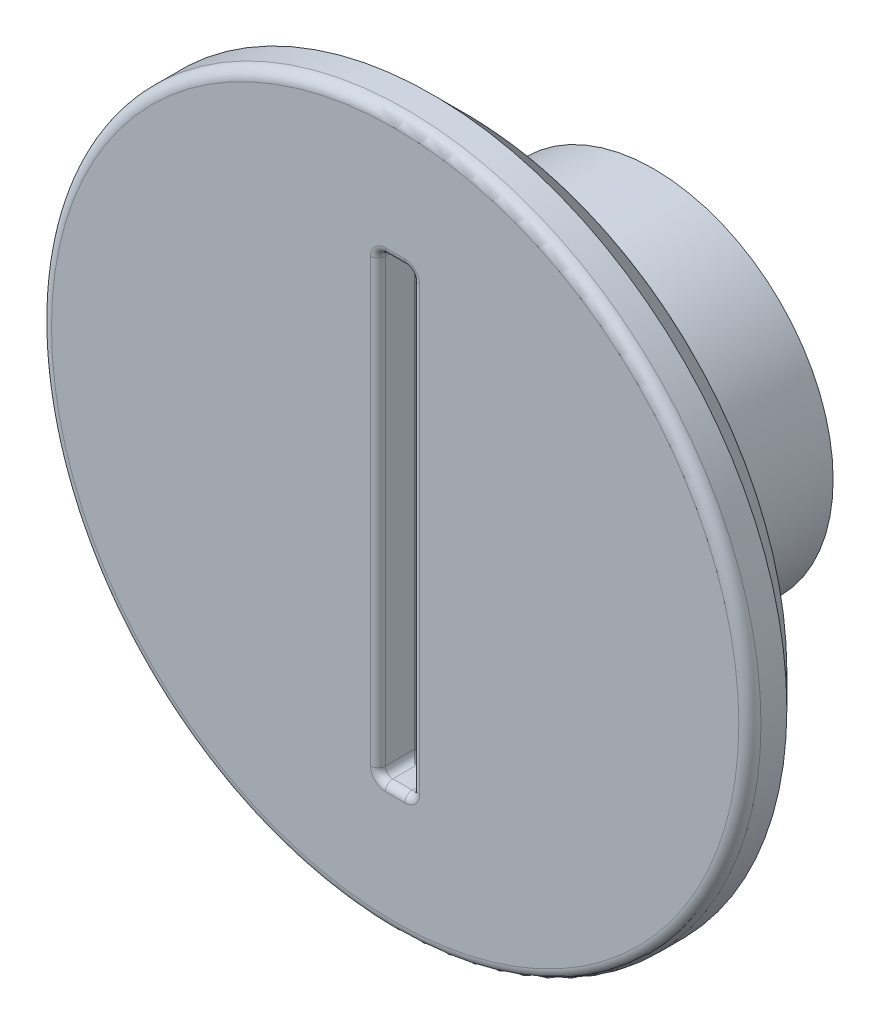
ISO-10303-21;
HEADER;
FILE_DESCRIPTION(('STEP AP214'),'2;1');
FILE_NAME('part.step','',(''),(''),'','','');
FILE_SCHEMA(('AUTOMOTIVE_DESIGN { 1 0 10303 214 1 1 1 1 }'));
ENDSEC;
DATA;
#1=APPLICATION_CONTEXT('core data for automotive mechanical design processes');
#2=APPLICATION_PROTOCOL_DEFINITION('international standard','automotive_design',2000,#1);
#3=PRODUCT_CONTEXT('',#1,'mechanical');
#4=PRODUCT('Part','Part','',(#3));
#5=PRODUCT_RELATED_PRODUCT_CATEGORY('part','',(#4));
#6=PRODUCT_DEFINITION_FORMATION('','',#4);
#7=PRODUCT_DEFINITION_CONTEXT('part definition',#1,'design');
#8=PRODUCT_DEFINITION('design','',#6,#7);
#9=PRODUCT_DEFINITION_SHAPE('','',#8);
#10=(LENGTH_UNIT() NAMED_UNIT(*) SI_UNIT(.MILLI.,.METRE.));
#11=(NAMED_UNIT(*) PLANE_ANGLE_UNIT() SI_UNIT($,.RADIAN.));
#12=(NAMED_UNIT(*) SI_UNIT($,.STERADIAN.) SOLID_ANGLE_UNIT());
#13=UNCERTAINTY_MEASURE_WITH_UNIT(LENGTH_MEASURE(1.E-05),#10,'distance_accuracy_value','');
#14=(GEOMETRIC_REPRESENTATION_CONTEXT(3) GLOBAL_UNCERTAINTY_ASSIGNED_CONTEXT((#13)) GLOBAL_UNIT_ASSIGNED_CONTEXT((#10,
#11,#12)) REPRESENTATION_CONTEXT('',''));
#15=CARTESIAN_POINT('',(0.,0.,0.));
#16=DIRECTION('',(0.,0.,1.));
#17=DIRECTION('',(1.,0.,0.));
#18=AXIS2_PLACEMENT_3D('',#15,#16,#17);
#19=CARTESIAN_POINT('',(0.,0.,2.));
#20=DIRECTION('',(0.,0.,1.));
#21=DIRECTION('',(1.,0.,0.));
#22=AXIS2_PLACEMENT_3D('',#19,#20,#21);
#23=PLANE('',#22);
#24=CARTESIAN_POINT('',(0.,0.,2.));
#25=DIRECTION('',(0.,0.,1.));
#26=DIRECTION('',(1.,0.,0.));
#27=AXIS2_PLACEMENT_3D('',#24,#25,#26);
#28=CIRCLE('',#27,9.3);
#29=CARTESIAN_POINT('',(9.3,0.,2.));
#30=VERTEX_POINT('',#29);
#31=EDGE_CURVE('E273',#30,#30,#28,.T.);
#32=ORIENTED_EDGE('',*,*,#31,.T.);
#33=EDGE_LOOP('',(#32));
#34=FACE_BOUND('',#33,.T.);
#35=CARTESIAN_POINT('',(-0.263137826376281,5.9730562337551,2.));
#36=DIRECTION('',(0.,0.,1.));
#37=DIRECTION('',(1.,0.,0.));
#38=AXIS2_PLACEMENT_3D('',#35,#36,#37);
#39=CIRCLE('',#38,0.4);
#40=CARTESIAN_POINT('',(-0.263137826376281,6.3730562337551,2.));
#41=VERTEX_POINT('',#40);
#42=CARTESIAN_POINT('',(-0.66313782637628,5.9730562337551,2.));
#43=VERTEX_POINT('',#42);
#44=EDGE_CURVE('E185',#41,#43,#39,.T.);
#45=ORIENTED_EDGE('',*,*,#44,.F.);
#46=DIRECTION('',(-1.,0.,0.));
#47=VECTOR('',#46,1.);
#48=CARTESIAN_POINT('',(0.463137826376281,6.3730562337551,2.));
#49=LINE('',#48,#47);
#50=CARTESIAN_POINT('',(0.263137826376281,6.3730562337551,2.));
#51=VERTEX_POINT('',#50);
#52=EDGE_CURVE('E177',#41,#51,#49,.F.);
#53=ORIENTED_EDGE('',*,*,#52,.T.);
#54=CARTESIAN_POINT('',(0.263137826376281,5.9730562337551,2.));
#55=DIRECTION('',(0.,0.,1.));
#56=DIRECTION('',(1.,0.,0.));
#57=AXIS2_PLACEMENT_3D('',#54,#55,#56);
#58=CIRCLE('',#57,0.4);
#59=CARTESIAN_POINT('',(0.66313782637628,5.9730562337551,2.));
#60=VERTEX_POINT('',#59);
#61=EDGE_CURVE('E176',#60,#51,#58,.T.);
#62=ORIENTED_EDGE('',*,*,#61,.F.);
#63=DIRECTION('',(0.,1.,0.));
#64=VECTOR('',#63,1.);
#65=CARTESIAN_POINT('',(0.66313782637628,-6.1730562337551,2.));
#66=LINE('',#65,#64);
#67=CARTESIAN_POINT('',(0.66313782637628,-5.9730562337551,2.));
#68=VERTEX_POINT('',#67);
#69=EDGE_CURVE('E175',#60,#68,#66,.F.);
#70=ORIENTED_EDGE('',*,*,#69,.T.);
#71=CARTESIAN_POINT('',(0.263137826376281,-5.9730562337551,2.));
#72=DIRECTION('',(0.,0.,1.));
#73=DIRECTION('',(1.,0.,0.));
#74=AXIS2_PLACEMENT_3D('',#71,#72,#73);
#75=CIRCLE('',#74,0.4);
#76=CARTESIAN_POINT('',(0.263137826376281,-6.3730562337551,2.));
#77=VERTEX_POINT('',#76);
#78=EDGE_CURVE('E169',#77,#68,#75,.T.);
#79=ORIENTED_EDGE('',*,*,#78,.F.);
#80=DIRECTION('',(1.,0.,0.));
#81=VECTOR('',#80,1.);
#82=CARTESIAN_POINT('',(-0.463137826376281,-6.3730562337551,2.));
#83=LINE('',#82,#81);
#84=CARTESIAN_POINT('',(-0.263137826376281,-6.3730562337551,2.));
#85=VERTEX_POINT('',#84);
#86=EDGE_CURVE('E161',#77,#85,#83,.F.);
#87=ORIENTED_EDGE('',*,*,#86,.T.);
#88=CARTESIAN_POINT('',(-0.263137826376281,-5.9730562337551,2.));
#89=DIRECTION('',(0.,0.,1.));
#90=DIRECTION('',(1.,0.,0.));
#91=AXIS2_PLACEMENT_3D('',#88,#89,#90);
#92=CIRCLE('',#91,0.4);
#93=CARTESIAN_POINT('',(-0.66313782637628,-5.9730562337551,2.));
#94=VERTEX_POINT('',#93);
#95=EDGE_CURVE('E158',#94,#85,#92,.T.);
#96=ORIENTED_EDGE('',*,*,#95,.F.);
#97=DIRECTION('',(0.,-1.,0.));
#98=VECTOR('',#97,1.);
#99=CARTESIAN_POINT('',(-0.66313782637628,6.1730562337551,2.));
#100=LINE('',#99,#98);
#101=EDGE_CURVE('E172',#94,#43,#100,.F.);
#102=ORIENTED_EDGE('',*,*,#101,.T.);
#103=EDGE_LOOP('',(#45,#53,#62,#70,#79,#87,#96,#102));
#104=FACE_BOUND('',#103,.T.);
#105=ADVANCED_FACE('F43',(#34,#104),#23,.T.);
#106=CARTESIAN_POINT('',(0.,0.,2.));
#107=DIRECTION('',(0.,0.,-1.));
#108=DIRECTION('',(-1.,0.,0.));
#109=AXIS2_PLACEMENT_3D('',#106,#107,#108);
#110=CYLINDRICAL_SURFACE('',#109,9.6);
#111=CARTESIAN_POINT('',(0.,0.,1.7));
#112=DIRECTION('',(0.,0.,1.));
#113=DIRECTION('',(1.,0.,0.));
#114=AXIS2_PLACEMENT_3D('',#111,#112,#113);
#115=CIRCLE('',#114,9.6);
#116=CARTESIAN_POINT('',(9.6,0.,1.7));
#117=VERTEX_POINT('',#116);
#118=EDGE_CURVE('E279',#117,#117,#115,.F.);
#119=ORIENTED_EDGE('',*,*,#118,.T.);
#120=EDGE_LOOP('',(#119));
#121=FACE_BOUND('',#120,.T.);
#122=CARTESIAN_POINT('',(0.,0.,0.999999999999997));
#123=DIRECTION('',(0.,0.,1.));
#124=DIRECTION('',(1.,0.,0.));
#125=AXIS2_PLACEMENT_3D('',#122,#123,#124);
#126=CIRCLE('',#125,9.6);
#127=CARTESIAN_POINT('',(9.6,0.,0.999999999999997));
#128=VERTEX_POINT('',#127);
#129=EDGE_CURVE('E275',#128,#128,#126,.T.);
#130=ORIENTED_EDGE('',*,*,#129,.T.);
#131=EDGE_LOOP('',(#130));
#132=FACE_BOUND('',#131,.T.);
#133=ADVANCED_FACE('F285',(#121,#132),#110,.T.);
#134=CARTESIAN_POINT('',(0.,0.,0.));
#135=DIRECTION('',(0.,0.,1.));
#136=DIRECTION('',(1.,0.,0.));
#137=AXIS2_PLACEMENT_3D('',#134,#135,#136);
#138=PLANE('',#137);
#139=CARTESIAN_POINT('',(0.,0.,0.));
#140=DIRECTION('',(0.,0.,1.));
#141=DIRECTION('',(1.,0.,0.));
#142=AXIS2_PLACEMENT_3D('',#139,#140,#141);
#143=CIRCLE('',#142,5.25244101478866);
#144=CARTESIAN_POINT('',(5.25244101478866,0.,0.));
#145=VERTEX_POINT('',#144);
#146=EDGE_CURVE('E51',#145,#145,#143,.T.);
#147=ORIENTED_EDGE('',*,*,#146,.T.);
#148=EDGE_LOOP('',(#147));
#149=FACE_BOUND('',#148,.T.);
#150=CARTESIAN_POINT('',(0.,0.,0.));
#151=DIRECTION('',(0.,0.,1.));
#152=DIRECTION('',(1.,0.,0.));
#153=AXIS2_PLACEMENT_3D('',#150,#151,#152);
#154=CIRCLE('',#153,8.43431457505076);
#155=CARTESIAN_POINT('',(8.43431457505076,0.,0.));
#156=VERTEX_POINT('',#155);
#157=EDGE_CURVE('E246',#156,#156,#154,.F.);
#158=ORIENTED_EDGE('',*,*,#157,.T.);
#159=EDGE_LOOP('',(#158));
#160=FACE_BOUND('',#159,.T.);
#161=ADVANCED_FACE('F252',(#149,#160),#138,.F.);
#162=CARTESIAN_POINT('',(0.,0.,0.999999999999997));
#163=DIRECTION('',(0.,0.,1.));
#164=DIRECTION('',(1.,0.,0.));
#165=AXIS2_PLACEMENT_3D('',#162,#163,#164);
#166=CONICAL_SURFACE('',#165,9.6,0.78539816339745);
#167=CARTESIAN_POINT('',(0.,0.,0.11715728752538));
#168=DIRECTION('',(0.,0.,1.));
#169=DIRECTION('',(1.,0.,0.));
#170=AXIS2_PLACEMENT_3D('',#167,#168,#169);
#171=CIRCLE('',#170,8.71715728752538);
#172=CARTESIAN_POINT('',(8.71715728752538,0.,0.11715728752538));
#173=VERTEX_POINT('',#172);
#174=EDGE_CURVE('E11',#173,#173,#171,.T.);
#175=ORIENTED_EDGE('',*,*,#174,.T.);
#176=EDGE_LOOP('',(#175));
#177=FACE_BOUND('',#176,.T.);
#178=ORIENTED_EDGE('',*,*,#129,.F.);
#179=EDGE_LOOP('',(#178));
#180=FACE_BOUND('',#179,.T.);
#181=ADVANCED_FACE('F288',(#177,#180),#166,.T.);
#182=CARTESIAN_POINT('',(0.,0.,1.7));
#183=DIRECTION('',(0.,0.,1.));
#184=DIRECTION('',(1.,0.,0.));
#185=AXIS2_PLACEMENT_3D('',#182,#183,#184);
#186=TOROIDAL_SURFACE('',#185,9.3,0.3);
#187=ORIENTED_EDGE('',*,*,#118,.F.);
#188=EDGE_LOOP('',(#187));
#189=FACE_BOUND('',#188,.T.);
#190=ORIENTED_EDGE('',*,*,#31,.F.);
#191=EDGE_LOOP('',(#190));
#192=FACE_BOUND('',#191,.T.);
#193=ADVANCED_FACE('F283',(#189,#192),#186,.T.);
#194=CARTESIAN_POINT('',(0.463137826376281,-6.1730562337551,1.));
#195=DIRECTION('',(1.,0.,0.));
#196=DIRECTION('',(0.,0.,-1.));
#197=AXIS2_PLACEMENT_3D('',#194,#195,#196);
#198=PLANE('',#197);
#199=DIRECTION('',(0.,1.,0.));
#200=VECTOR('',#199,1.);
#201=CARTESIAN_POINT('',(0.463137826376281,-6.1730562337551,1.));
#202=LINE('',#201,#200);
#203=CARTESIAN_POINT('',(0.463137826376281,-5.9730562337551,1.));
#204=VERTEX_POINT('',#203);
#205=CARTESIAN_POINT('',(0.463137826376281,5.9730562337551,1.));
#206=VERTEX_POINT('',#205);
#207=EDGE_CURVE('E139',#204,#206,#202,.T.);
#208=ORIENTED_EDGE('',*,*,#207,.F.);
#209=DIRECTION('',(0.,0.,1.));
#210=VECTOR('',#209,1.);
#211=CARTESIAN_POINT('',(0.463137826376281,-5.9730562337551,2.));
#212=LINE('',#211,#210);
#213=CARTESIAN_POINT('',(0.463137826376281,-5.9730562337551,1.8));
#214=VERTEX_POINT('',#213);
#215=EDGE_CURVE('E193',#204,#214,#212,.T.);
#216=ORIENTED_EDGE('',*,*,#215,.T.);
#217=DIRECTION('',(0.,1.,0.));
#218=VECTOR('',#217,1.);
#219=CARTESIAN_POINT('',(0.463137826376281,6.1730562337551,1.8));
#220=LINE('',#219,#218);
#221=CARTESIAN_POINT('',(0.463137826376281,5.9730562337551,1.8));
#222=VERTEX_POINT('',#221);
#223=EDGE_CURVE('E194',#214,#222,#220,.T.);
#224=ORIENTED_EDGE('',*,*,#223,.T.);
#225=DIRECTION('',(0.,0.,1.));
#226=VECTOR('',#225,1.);
#227=CARTESIAN_POINT('',(0.463137826376281,5.9730562337551,1.));
#228=LINE('',#227,#226);
#229=EDGE_CURVE('E192',#222,#206,#228,.F.);
#230=ORIENTED_EDGE('',*,*,#229,.T.);
#231=EDGE_LOOP('',(#208,#216,#224,#230));
#232=FACE_BOUND('',#231,.T.);
#233=ADVANCED_FACE('F289',(#232),#198,.F.);
#234=CARTESIAN_POINT('',(-0.463137826376281,-6.1730562337551,1.));
#235=DIRECTION('',(0.,-1.,0.));
#236=DIRECTION('',(0.,0.,-1.));
#237=AXIS2_PLACEMENT_3D('',#234,#235,#236);
#238=PLANE('',#237);
#239=DIRECTION('',(1.,0.,0.));
#240=VECTOR('',#239,1.);
#241=CARTESIAN_POINT('',(-0.463137826376281,-6.1730562337551,1.2));
#242=LINE('',#241,#240);
#243=CARTESIAN_POINT('',(0.263137826376281,-6.1730562337551,1.2));
#244=VERTEX_POINT('',#243);
#245=CARTESIAN_POINT('',(-0.263137826376281,-6.1730562337551,1.2));
#246=VERTEX_POINT('',#245);
#247=EDGE_CURVE('E59',#244,#246,#242,.F.);
#248=ORIENTED_EDGE('',*,*,#247,.T.);
#249=DIRECTION('',(0.,0.,1.));
#250=VECTOR('',#249,1.);
#251=CARTESIAN_POINT('',(-0.263137826376281,-6.1730562337551,2.));
#252=LINE('',#251,#250);
#253=CARTESIAN_POINT('',(-0.263137826376281,-6.1730562337551,1.8));
#254=VERTEX_POINT('',#253);
#255=EDGE_CURVE('E203',#246,#254,#252,.T.);
#256=ORIENTED_EDGE('',*,*,#255,.T.);
#257=DIRECTION('',(1.,0.,0.));
#258=VECTOR('',#257,1.);
#259=CARTESIAN_POINT('',(0.463137826376281,-6.1730562337551,1.8));
#260=LINE('',#259,#258);
#261=CARTESIAN_POINT('',(0.263137826376281,-6.1730562337551,1.8));
#262=VERTEX_POINT('',#261);
#263=EDGE_CURVE('E200',#254,#262,#260,.T.);
#264=ORIENTED_EDGE('',*,*,#263,.T.);
#265=DIRECTION('',(0.,0.,1.));
#266=VECTOR('',#265,1.);
#267=CARTESIAN_POINT('',(0.263137826376281,-6.1730562337551,1.));
#268=LINE('',#267,#266);
#269=EDGE_CURVE('E64',#262,#244,#268,.F.);
#270=ORIENTED_EDGE('',*,*,#269,.T.);
#271=EDGE_LOOP('',(#248,#256,#264,#270));
#272=FACE_BOUND('',#271,.T.);
#273=ADVANCED_FACE('F370',(#272),#238,.F.);
#274=CARTESIAN_POINT('',(-0.463137826376281,-6.1730562337551,1.));
#275=DIRECTION('',(-1.,0.,0.));
#276=DIRECTION('',(0.,0.,1.));
#277=AXIS2_PLACEMENT_3D('',#274,#275,#276);
#278=PLANE('',#277);
#279=DIRECTION('',(0.,-1.,0.));
#280=VECTOR('',#279,1.);
#281=CARTESIAN_POINT('',(-0.463137826376281,-6.1730562337551,1.8));
#282=LINE('',#281,#280);
#283=CARTESIAN_POINT('',(-0.463137826376281,5.9730562337551,1.8));
#284=VERTEX_POINT('',#283);
#285=CARTESIAN_POINT('',(-0.463137826376281,-5.9730562337551,1.8));
#286=VERTEX_POINT('',#285);
#287=EDGE_CURVE('E190',#284,#286,#282,.T.);
#288=ORIENTED_EDGE('',*,*,#287,.T.);
#289=DIRECTION('',(0.,0.,1.));
#290=VECTOR('',#289,1.);
#291=CARTESIAN_POINT('',(-0.463137826376281,-5.9730562337551,1.));
#292=LINE('',#291,#290);
#293=CARTESIAN_POINT('',(-0.463137826376281,-5.9730562337551,1.));
#294=VERTEX_POINT('',#293);
#295=EDGE_CURVE('E186',#286,#294,#292,.F.);
#296=ORIENTED_EDGE('',*,*,#295,.T.);
#297=DIRECTION('',(0.,-1.,0.));
#298=VECTOR('',#297,1.);
#299=CARTESIAN_POINT('',(-0.463137826376281,-6.1730562337551,1.));
#300=LINE('',#299,#298);
#301=CARTESIAN_POINT('',(-0.463137826376281,5.9730562337551,1.));
#302=VERTEX_POINT('',#301);
#303=EDGE_CURVE('E154',#302,#294,#300,.T.);
#304=ORIENTED_EDGE('',*,*,#303,.F.);
#305=DIRECTION('',(0.,0.,1.));
#306=VECTOR('',#305,1.);
#307=CARTESIAN_POINT('',(-0.463137826376281,5.9730562337551,2.));
#308=LINE('',#307,#306);
#309=EDGE_CURVE('E184',#302,#284,#308,.T.);
#310=ORIENTED_EDGE('',*,*,#309,.T.);
#311=EDGE_LOOP('',(#288,#296,#304,#310));
#312=FACE_BOUND('',#311,.T.);
#313=ADVANCED_FACE('F311',(#312),#278,.F.);
#314=CARTESIAN_POINT('',(-0.463137826376281,6.1730562337551,1.));
#315=DIRECTION('',(0.,1.,0.));
#316=DIRECTION('',(0.,0.,1.));
#317=AXIS2_PLACEMENT_3D('',#314,#315,#316);
#318=PLANE('',#317);
#319=DIRECTION('',(-1.,0.,0.));
#320=VECTOR('',#319,1.);
#321=CARTESIAN_POINT('',(-0.463137826376281,6.1730562337551,1.));
#322=LINE('',#321,#320);
#323=CARTESIAN_POINT('',(0.263137826376281,6.1730562337551,1.));
#324=VERTEX_POINT('',#323);
#325=CARTESIAN_POINT('',(-0.263137826376281,6.1730562337551,1.));
#326=VERTEX_POINT('',#325);
#327=EDGE_CURVE('E138',#324,#326,#322,.T.);
#328=ORIENTED_EDGE('',*,*,#327,.F.);
#329=DIRECTION('',(0.,0.,1.));
#330=VECTOR('',#329,1.);
#331=CARTESIAN_POINT('',(0.263137826376281,6.1730562337551,2.));
#332=LINE('',#331,#330);
#333=CARTESIAN_POINT('',(0.263137826376281,6.1730562337551,1.8));
#334=VERTEX_POINT('',#333);
#335=EDGE_CURVE('E146',#324,#334,#332,.T.);
#336=ORIENTED_EDGE('',*,*,#335,.T.);
#337=DIRECTION('',(-1.,0.,0.));
#338=VECTOR('',#337,1.);
#339=CARTESIAN_POINT('',(-0.463137826376281,6.1730562337551,1.8));
#340=LINE('',#339,#338);
#341=CARTESIAN_POINT('',(-0.263137826376281,6.1730562337551,1.8));
#342=VERTEX_POINT('',#341);
#343=EDGE_CURVE('E160',#334,#342,#340,.T.);
#344=ORIENTED_EDGE('',*,*,#343,.T.);
#345=DIRECTION('',(0.,0.,1.));
#346=VECTOR('',#345,1.);
#347=CARTESIAN_POINT('',(-0.263137826376281,6.1730562337551,1.));
#348=LINE('',#347,#346);
#349=EDGE_CURVE('E155',#342,#326,#348,.F.);
#350=ORIENTED_EDGE('',*,*,#349,.T.);
#351=EDGE_LOOP('',(#328,#336,#344,#350));
#352=FACE_BOUND('',#351,.T.);
#353=ADVANCED_FACE('F150',(#352),#318,.F.);
#354=CARTESIAN_POINT('',(0.,0.,1.));
#355=DIRECTION('',(0.,0.,-1.));
#356=DIRECTION('',(-1.,0.,0.));
#357=AXIS2_PLACEMENT_3D('',#354,#355,#356);
#358=PLANE('',#357);
#359=ORIENTED_EDGE('',*,*,#303,.T.);
#360=DIRECTION('',(1.,0.,0.));
#361=VECTOR('',#360,1.);
#362=CARTESIAN_POINT('',(0.463137826376281,-5.9730562337551,1.));
#363=LINE('',#362,#361);
#364=EDGE_CURVE('E141',#294,#204,#363,.T.);
#365=ORIENTED_EDGE('',*,*,#364,.T.);
#366=ORIENTED_EDGE('',*,*,#207,.T.);
#367=CARTESIAN_POINT('',(0.263137826376281,5.9730562337551,1.));
#368=DIRECTION('',(0.,0.,-1.));
#369=DIRECTION('',(-1.,0.,0.));
#370=AXIS2_PLACEMENT_3D('',#367,#368,#369);
#371=CIRCLE('',#370,0.2);
#372=EDGE_CURVE('E135',#206,#324,#371,.F.);
#373=ORIENTED_EDGE('',*,*,#372,.T.);
#374=ORIENTED_EDGE('',*,*,#327,.T.);
#375=CARTESIAN_POINT('',(-0.263137826376281,5.9730562337551,1.));
#376=DIRECTION('',(0.,0.,-1.));
#377=DIRECTION('',(-1.,0.,0.));
#378=AXIS2_PLACEMENT_3D('',#375,#376,#377);
#379=CIRCLE('',#378,0.2);
#380=EDGE_CURVE('E144',#326,#302,#379,.F.);
#381=ORIENTED_EDGE('',*,*,#380,.T.);
#382=EDGE_LOOP('',(#359,#365,#366,#373,#374,#381));
#383=FACE_BOUND('',#382,.T.);
#384=ADVANCED_FACE('F133',(#383),#358,.F.);
#385=CARTESIAN_POINT('',(0.,-5.9730562337551,1.2));
#386=DIRECTION('',(-1.,0.,0.));
#387=DIRECTION('',(0.,0.,1.));
#388=AXIS2_PLACEMENT_3D('',#385,#386,#387);
#389=CYLINDRICAL_SURFACE('',#388,0.2);
#390=CARTESIAN_POINT('',(-0.263137826376281,-5.9730562337551,1.2));
#391=DIRECTION('',(0.707106781186547,0.,-0.707106781186547));
#392=DIRECTION('',(-0.707106781186547,0.,-0.707106781186547));
#393=AXIS2_PLACEMENT_3D('',#390,#391,#392);
#394=ELLIPSE('',#393,0.282842712474619,0.2);
#395=EDGE_CURVE('E238',#246,#294,#394,.T.);
#396=ORIENTED_EDGE('',*,*,#395,.F.);
#397=ORIENTED_EDGE('',*,*,#247,.F.);
#398=CARTESIAN_POINT('',(0.263137826376281,-5.9730562337551,1.2));
#399=DIRECTION('',(-0.707106781186547,0.,-0.707106781186547));
#400=DIRECTION('',(-0.707106781186547,0.,0.707106781186547));
#401=AXIS2_PLACEMENT_3D('',#398,#399,#400);
#402=ELLIPSE('',#401,0.282842712474619,0.2);
#403=EDGE_CURVE('E241',#204,#244,#402,.T.);
#404=ORIENTED_EDGE('',*,*,#403,.F.);
#405=ORIENTED_EDGE('',*,*,#364,.F.);
#406=EDGE_LOOP('',(#396,#397,#404,#405));
#407=FACE_BOUND('',#406,.T.);
#408=ADVANCED_FACE('F356',(#407),#389,.F.);
#409=CARTESIAN_POINT('',(0.263137826376281,-5.9730562337551,1.));
#410=DIRECTION('',(0.,0.,-1.));
#411=DIRECTION('',(-1.,0.,0.));
#412=AXIS2_PLACEMENT_3D('',#409,#410,#411);
#413=CYLINDRICAL_SURFACE('',#412,0.2);
#414=ORIENTED_EDGE('',*,*,#403,.T.);
#415=ORIENTED_EDGE('',*,*,#269,.F.);
#416=CARTESIAN_POINT('',(0.263137826376281,-5.9730562337551,1.8));
#417=DIRECTION('',(0.,0.,1.));
#418=DIRECTION('',(1.,0.,0.));
#419=AXIS2_PLACEMENT_3D('',#416,#417,#418);
#420=CIRCLE('',#419,0.2);
#421=EDGE_CURVE('E235',#214,#262,#420,.F.);
#422=ORIENTED_EDGE('',*,*,#421,.F.);
#423=ORIENTED_EDGE('',*,*,#215,.F.);
#424=EDGE_LOOP('',(#414,#415,#422,#423));
#425=FACE_BOUND('',#424,.T.);
#426=ADVANCED_FACE('F355',(#425),#413,.F.);
#427=CARTESIAN_POINT('',(-0.263137826376281,-5.9730562337551,1.));
#428=DIRECTION('',(0.,0.,-1.));
#429=DIRECTION('',(-1.,0.,0.));
#430=AXIS2_PLACEMENT_3D('',#427,#428,#429);
#431=CYLINDRICAL_SURFACE('',#430,0.2);
#432=ORIENTED_EDGE('',*,*,#395,.T.);
#433=ORIENTED_EDGE('',*,*,#295,.F.);
#434=CARTESIAN_POINT('',(-0.263137826376281,-5.9730562337551,1.8));
#435=DIRECTION('',(0.,0.,1.));
#436=DIRECTION('',(1.,0.,0.));
#437=AXIS2_PLACEMENT_3D('',#434,#435,#436);
#438=CIRCLE('',#437,0.2);
#439=EDGE_CURVE('E230',#254,#286,#438,.F.);
#440=ORIENTED_EDGE('',*,*,#439,.F.);
#441=ORIENTED_EDGE('',*,*,#255,.F.);
#442=EDGE_LOOP('',(#432,#433,#440,#441));
#443=FACE_BOUND('',#442,.T.);
#444=ADVANCED_FACE('F317',(#443),#431,.F.);
#445=CARTESIAN_POINT('',(-0.463137826376281,-6.3730562337551,1.8));
#446=DIRECTION('',(-1.,0.,0.));
#447=DIRECTION('',(0.,0.,1.));
#448=AXIS2_PLACEMENT_3D('',#445,#446,#447);
#449=CYLINDRICAL_SURFACE('',#448,0.2);
#450=CARTESIAN_POINT('',(-0.263137826376281,-6.3730562337551,1.8));
#451=DIRECTION('',(-1.,0.,0.));
#452=DIRECTION('',(0.,0.,1.));
#453=AXIS2_PLACEMENT_3D('',#450,#451,#452);
#454=CIRCLE('',#453,0.2);
#455=EDGE_CURVE('E227',#85,#254,#454,.T.);
#456=ORIENTED_EDGE('',*,*,#455,.F.);
#457=ORIENTED_EDGE('',*,*,#86,.F.);
#458=CARTESIAN_POINT('',(0.263137826376281,-6.3730562337551,1.8));
#459=DIRECTION('',(1.,0.,0.));
#460=DIRECTION('',(0.,0.,-1.));
#461=AXIS2_PLACEMENT_3D('',#458,#459,#460);
#462=CIRCLE('',#461,0.2);
#463=EDGE_CURVE('E232',#262,#77,#462,.T.);
#464=ORIENTED_EDGE('',*,*,#463,.F.);
#465=ORIENTED_EDGE('',*,*,#263,.F.);
#466=EDGE_LOOP('',(#456,#457,#464,#465));
#467=FACE_BOUND('',#466,.T.);
#468=ADVANCED_FACE('F349',(#467),#449,.T.);
#469=CARTESIAN_POINT('',(0.263137826376281,-5.9730562337551,1.8));
#470=DIRECTION('',(0.,0.,1.));
#471=DIRECTION('',(1.,0.,0.));
#472=AXIS2_PLACEMENT_3D('',#469,#470,#471);
#473=TOROIDAL_SURFACE('',#472,0.4,0.2);
#474=ORIENTED_EDGE('',*,*,#463,.T.);
#475=ORIENTED_EDGE('',*,*,#78,.T.);
#476=CARTESIAN_POINT('',(0.66313782637628,-5.9730562337551,1.8));
#477=DIRECTION('',(0.,-1.,0.));
#478=DIRECTION('',(0.,0.,-1.));
#479=AXIS2_PLACEMENT_3D('',#476,#477,#478);
#480=CIRCLE('',#479,0.2);
#481=EDGE_CURVE('E223',#214,#68,#480,.F.);
#482=ORIENTED_EDGE('',*,*,#481,.F.);
#483=ORIENTED_EDGE('',*,*,#421,.T.);
#484=EDGE_LOOP('',(#474,#475,#482,#483));
#485=FACE_BOUND('',#484,.T.);
#486=ADVANCED_FACE('F343',(#485),#473,.T.);
#487=CARTESIAN_POINT('',(-0.263137826376281,-5.9730562337551,1.8));
#488=DIRECTION('',(0.,0.,1.));
#489=DIRECTION('',(1.,0.,0.));
#490=AXIS2_PLACEMENT_3D('',#487,#488,#489);
#491=TOROIDAL_SURFACE('',#490,0.4,0.2);
#492=ORIENTED_EDGE('',*,*,#455,.T.);
#493=ORIENTED_EDGE('',*,*,#439,.T.);
#494=CARTESIAN_POINT('',(-0.66313782637628,-5.9730562337551,1.8));
#495=DIRECTION('',(0.,-1.,0.));
#496=DIRECTION('',(0.,0.,-1.));
#497=AXIS2_PLACEMENT_3D('',#494,#495,#496);
#498=CIRCLE('',#497,0.2);
#499=EDGE_CURVE('E221',#94,#286,#498,.F.);
#500=ORIENTED_EDGE('',*,*,#499,.F.);
#501=ORIENTED_EDGE('',*,*,#95,.T.);
#502=EDGE_LOOP('',(#492,#493,#500,#501));
#503=FACE_BOUND('',#502,.T.);
#504=ADVANCED_FACE('F322',(#503),#491,.T.);
#505=CARTESIAN_POINT('',(0.66313782637628,-6.1730562337551,1.8));
#506=DIRECTION('',(0.,-1.,0.));
#507=DIRECTION('',(0.,0.,-1.));
#508=AXIS2_PLACEMENT_3D('',#505,#506,#507);
#509=CYLINDRICAL_SURFACE('',#508,0.2);
#510=ORIENTED_EDGE('',*,*,#481,.T.);
#511=ORIENTED_EDGE('',*,*,#69,.F.);
#512=CARTESIAN_POINT('',(0.66313782637628,5.9730562337551,1.8));
#513=DIRECTION('',(0.,1.,0.));
#514=DIRECTION('',(0.,0.,1.));
#515=AXIS2_PLACEMENT_3D('',#512,#513,#514);
#516=CIRCLE('',#515,0.2);
#517=EDGE_CURVE('E219',#222,#60,#516,.T.);
#518=ORIENTED_EDGE('',*,*,#517,.F.);
#519=ORIENTED_EDGE('',*,*,#223,.F.);
#520=EDGE_LOOP('',(#510,#511,#518,#519));
#521=FACE_BOUND('',#520,.T.);
#522=ADVANCED_FACE('F339',(#521),#509,.T.);
#523=CARTESIAN_POINT('',(0.263137826376281,5.9730562337551,1.));
#524=DIRECTION('',(0.,0.,-1.));
#525=DIRECTION('',(-1.,0.,0.));
#526=AXIS2_PLACEMENT_3D('',#523,#524,#525);
#527=CYLINDRICAL_SURFACE('',#526,0.2);
#528=ORIENTED_EDGE('',*,*,#372,.F.);
#529=ORIENTED_EDGE('',*,*,#229,.F.);
#530=CARTESIAN_POINT('',(0.263137826376281,5.9730562337551,1.8));
#531=DIRECTION('',(0.,0.,1.));
#532=DIRECTION('',(1.,0.,0.));
#533=AXIS2_PLACEMENT_3D('',#530,#531,#532);
#534=CIRCLE('',#533,0.2);
#535=EDGE_CURVE('E157',#334,#222,#534,.F.);
#536=ORIENTED_EDGE('',*,*,#535,.F.);
#537=ORIENTED_EDGE('',*,*,#335,.F.);
#538=EDGE_LOOP('',(#528,#529,#536,#537));
#539=FACE_BOUND('',#538,.T.);
#540=ADVANCED_FACE('F153',(#539),#527,.F.);
#541=CARTESIAN_POINT('',(-0.263137826376281,5.9730562337551,1.));
#542=DIRECTION('',(0.,0.,-1.));
#543=DIRECTION('',(-1.,0.,0.));
#544=AXIS2_PLACEMENT_3D('',#541,#542,#543);
#545=CYLINDRICAL_SURFACE('',#544,0.2);
#546=ORIENTED_EDGE('',*,*,#380,.F.);
#547=ORIENTED_EDGE('',*,*,#349,.F.);
#548=CARTESIAN_POINT('',(-0.263137826376281,5.9730562337551,1.8));
#549=DIRECTION('',(0.,0.,1.));
#550=DIRECTION('',(1.,0.,0.));
#551=AXIS2_PLACEMENT_3D('',#548,#549,#550);
#552=CIRCLE('',#551,0.2);
#553=EDGE_CURVE('E211',#284,#342,#552,.F.);
#554=ORIENTED_EDGE('',*,*,#553,.F.);
#555=ORIENTED_EDGE('',*,*,#309,.F.);
#556=EDGE_LOOP('',(#546,#547,#554,#555));
#557=FACE_BOUND('',#556,.T.);
#558=ADVANCED_FACE('F310',(#557),#545,.F.);
#559=CARTESIAN_POINT('',(-0.66313782637628,-6.1730562337551,1.8));
#560=DIRECTION('',(0.,1.,0.));
#561=DIRECTION('',(0.,0.,1.));
#562=AXIS2_PLACEMENT_3D('',#559,#560,#561);
#563=CYLINDRICAL_SURFACE('',#562,0.2);
#564=ORIENTED_EDGE('',*,*,#499,.T.);
#565=ORIENTED_EDGE('',*,*,#287,.F.);
#566=CARTESIAN_POINT('',(-0.66313782637628,5.9730562337551,1.8));
#567=DIRECTION('',(0.,1.,0.));
#568=DIRECTION('',(0.,0.,1.));
#569=AXIS2_PLACEMENT_3D('',#566,#567,#568);
#570=CIRCLE('',#569,0.2);
#571=EDGE_CURVE('E212',#43,#284,#570,.T.);
#572=ORIENTED_EDGE('',*,*,#571,.F.);
#573=ORIENTED_EDGE('',*,*,#101,.F.);
#574=EDGE_LOOP('',(#564,#565,#572,#573));
#575=FACE_BOUND('',#574,.T.);
#576=ADVANCED_FACE('F321',(#575),#563,.T.);
#577=CARTESIAN_POINT('',(0.263137826376281,5.9730562337551,1.8));
#578=DIRECTION('',(0.,0.,1.));
#579=DIRECTION('',(1.,0.,0.));
#580=AXIS2_PLACEMENT_3D('',#577,#578,#579);
#581=TOROIDAL_SURFACE('',#580,0.4,0.2);
#582=ORIENTED_EDGE('',*,*,#517,.T.);
#583=ORIENTED_EDGE('',*,*,#61,.T.);
#584=CARTESIAN_POINT('',(0.263137826376281,6.3730562337551,1.8));
#585=DIRECTION('',(1.,0.,0.));
#586=DIRECTION('',(0.,0.,-1.));
#587=AXIS2_PLACEMENT_3D('',#584,#585,#586);
#588=CIRCLE('',#587,0.2);
#589=EDGE_CURVE('E206',#334,#51,#588,.F.);
#590=ORIENTED_EDGE('',*,*,#589,.F.);
#591=ORIENTED_EDGE('',*,*,#535,.T.);
#592=EDGE_LOOP('',(#582,#583,#590,#591));
#593=FACE_BOUND('',#592,.T.);
#594=ADVANCED_FACE('F327',(#593),#581,.T.);
#595=CARTESIAN_POINT('',(-0.263137826376281,5.9730562337551,1.8));
#596=DIRECTION('',(0.,0.,1.));
#597=DIRECTION('',(1.,0.,0.));
#598=AXIS2_PLACEMENT_3D('',#595,#596,#597);
#599=TOROIDAL_SURFACE('',#598,0.4,0.2);
#600=ORIENTED_EDGE('',*,*,#571,.T.);
#601=ORIENTED_EDGE('',*,*,#553,.T.);
#602=CARTESIAN_POINT('',(-0.263137826376281,6.3730562337551,1.8));
#603=DIRECTION('',(-1.,0.,0.));
#604=DIRECTION('',(0.,0.,1.));
#605=AXIS2_PLACEMENT_3D('',#602,#603,#604);
#606=CIRCLE('',#605,0.2);
#607=EDGE_CURVE('E207',#41,#342,#606,.F.);
#608=ORIENTED_EDGE('',*,*,#607,.F.);
#609=ORIENTED_EDGE('',*,*,#44,.T.);
#610=EDGE_LOOP('',(#600,#601,#608,#609));
#611=FACE_BOUND('',#610,.T.);
#612=ADVANCED_FACE('F303',(#611),#599,.T.);
#613=CARTESIAN_POINT('',(-0.463137826376281,6.3730562337551,1.8));
#614=DIRECTION('',(1.,0.,0.));
#615=DIRECTION('',(0.,0.,-1.));
#616=AXIS2_PLACEMENT_3D('',#613,#614,#615);
#617=CYLINDRICAL_SURFACE('',#616,0.2);
#618=ORIENTED_EDGE('',*,*,#589,.T.);
#619=ORIENTED_EDGE('',*,*,#52,.F.);
#620=ORIENTED_EDGE('',*,*,#607,.T.);
#621=ORIENTED_EDGE('',*,*,#343,.F.);
#622=EDGE_LOOP('',(#618,#619,#620,#621));
#623=FACE_BOUND('',#622,.T.);
#624=ADVANCED_FACE('F264',(#623),#617,.T.);
#625=CARTESIAN_POINT('',(0.,0.,-5.));
#626=DIRECTION('',(0.,0.,1.));
#627=DIRECTION('',(1.,0.,0.));
#628=AXIS2_PLACEMENT_3D('',#625,#626,#627);
#629=CYLINDRICAL_SURFACE('',#628,4.85244101478866);
#630=CARTESIAN_POINT('',(0.,0.,-0.4));
#631=DIRECTION('',(0.,0.,1.));
#632=DIRECTION('',(1.,0.,0.));
#633=AXIS2_PLACEMENT_3D('',#630,#631,#632);
#634=CIRCLE('',#633,4.85244101478866);
#635=CARTESIAN_POINT('',(4.85244101478866,0.,-0.4));
#636=VERTEX_POINT('',#635);
#637=EDGE_CURVE('E202',#636,#636,#634,.F.);
#638=ORIENTED_EDGE('',*,*,#637,.T.);
#639=EDGE_LOOP('',(#638));
#640=FACE_BOUND('',#639,.T.);
#641=CARTESIAN_POINT('',(0.,0.,-5.));
#642=DIRECTION('',(0.,0.,-1.));
#643=DIRECTION('',(-1.,0.,0.));
#644=AXIS2_PLACEMENT_3D('',#641,#642,#643);
#645=CIRCLE('',#644,4.85244101478866);
#646=CARTESIAN_POINT('',(-4.85244101478866,0.,-5.));
#647=VERTEX_POINT('',#646);
#648=EDGE_CURVE('E209',#647,#647,#645,.T.);
#649=ORIENTED_EDGE('',*,*,#648,.F.);
#650=EDGE_LOOP('',(#649));
#651=FACE_BOUND('',#650,.T.);
#652=ADVANCED_FACE('F258',(#640,#651),#629,.T.);
#653=CARTESIAN_POINT('',(0.,0.,-5.));
#654=DIRECTION('',(0.,0.,-1.));
#655=DIRECTION('',(-1.,0.,0.));
#656=AXIS2_PLACEMENT_3D('',#653,#654,#655);
#657=PLANE('',#656);
#658=ORIENTED_EDGE('',*,*,#648,.T.);
#659=EDGE_LOOP('',(#658));
#660=FACE_BOUND('',#659,.T.);
#661=ADVANCED_FACE('F260',(#660),#657,.T.);
#662=CARTESIAN_POINT('',(0.,0.,-0.4));
#663=DIRECTION('',(0.,0.,1.));
#664=DIRECTION('',(1.,0.,0.));
#665=AXIS2_PLACEMENT_3D('',#662,#663,#664);
#666=TOROIDAL_SURFACE('',#665,5.25244101478866,0.4);
#667=ORIENTED_EDGE('',*,*,#146,.F.);
#668=EDGE_LOOP('',(#667));
#669=FACE_BOUND('',#668,.T.);
#670=ORIENTED_EDGE('',*,*,#637,.F.);
#671=EDGE_LOOP('',(#670));
#672=FACE_BOUND('',#671,.T.);
#673=ADVANCED_FACE('F251',(#669,#672),#666,.F.);
#674=CARTESIAN_POINT('',(0.,0.,0.4));
#675=DIRECTION('',(0.,0.,1.));
#676=DIRECTION('',(1.,0.,0.));
#677=AXIS2_PLACEMENT_3D('',#674,#675,#676);
#678=TOROIDAL_SURFACE('',#677,8.43431457505076,0.4);
#679=ORIENTED_EDGE('',*,*,#174,.F.);
#680=EDGE_LOOP('',(#679));
#681=FACE_BOUND('',#680,.T.);
#682=ORIENTED_EDGE('',*,*,#157,.F.);
#683=EDGE_LOOP('',(#682));
#684=FACE_BOUND('',#683,.T.);
#685=ADVANCED_FACE('F44',(#681,#684),#678,.T.);
#686=CLOSED_SHELL('',(#105,#133,#161,#181,#193,#233,#273,#313,#353,#384,#408,#426,#444,#468,
#486,#504,#522,#540,#558,#576,#594,#612,#624,#652,#661,#673,#685));
#687=MANIFOLD_SOLID_BREP('B2',#686);
#688=ADVANCED_BREP_SHAPE_REPRESENTATION('',(#18,#687),#14);
#689=SHAPE_DEFINITION_REPRESENTATION(#9,#688);
ENDSEC;
END-ISO-10303-21;
